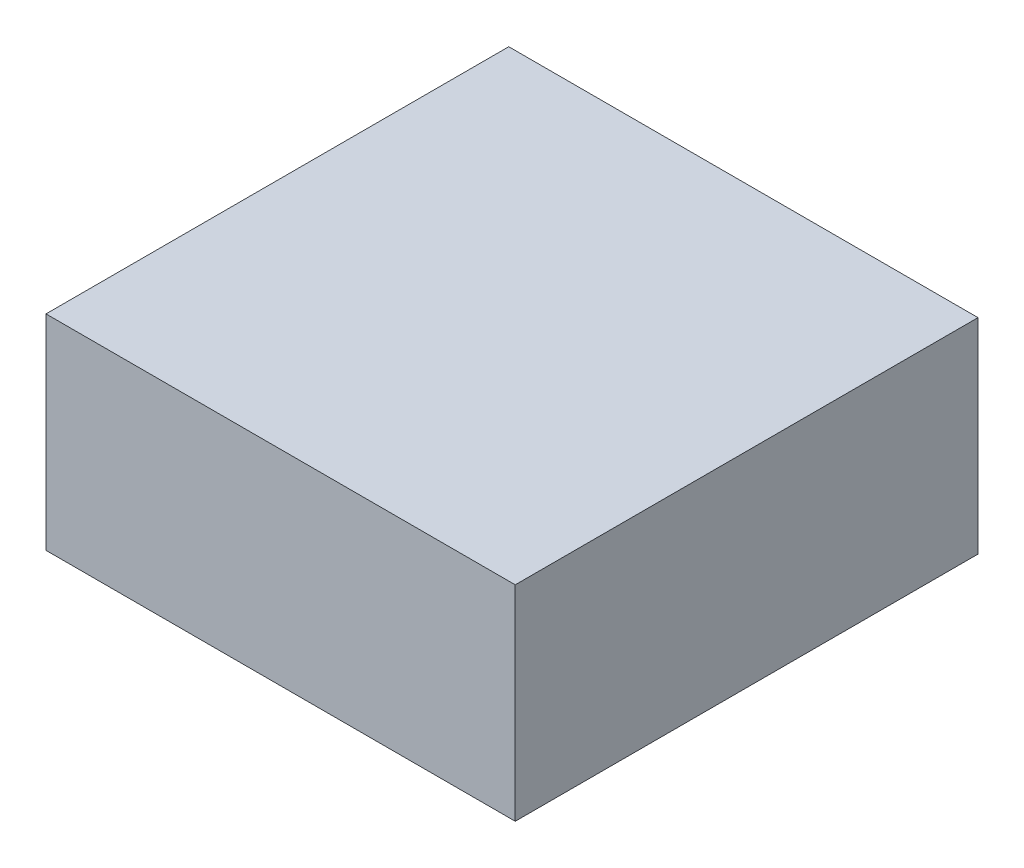
ISO-10303-21;
HEADER;
FILE_DESCRIPTION(('STEP AP214'),'2;1');
FILE_NAME('part.step','',(''),(''),'','','');
FILE_SCHEMA(('AUTOMOTIVE_DESIGN { 1 0 10303 214 1 1 1 1 }'));
ENDSEC;
DATA;
#1=APPLICATION_CONTEXT('core data for automotive mechanical design processes');
#2=APPLICATION_PROTOCOL_DEFINITION('international standard','automotive_design',2000,#1);
#3=PRODUCT_CONTEXT('',#1,'mechanical');
#4=PRODUCT('Part','Part','',(#3));
#5=PRODUCT_RELATED_PRODUCT_CATEGORY('part','',(#4));
#6=PRODUCT_DEFINITION_FORMATION('','',#4);
#7=PRODUCT_DEFINITION_CONTEXT('part definition',#1,'design');
#8=PRODUCT_DEFINITION('design','',#6,#7);
#9=PRODUCT_DEFINITION_SHAPE('','',#8);
#10=(LENGTH_UNIT() NAMED_UNIT(*) SI_UNIT(.MILLI.,.METRE.));
#11=(NAMED_UNIT(*) PLANE_ANGLE_UNIT() SI_UNIT($,.RADIAN.));
#12=(NAMED_UNIT(*) SI_UNIT($,.STERADIAN.) SOLID_ANGLE_UNIT());
#13=UNCERTAINTY_MEASURE_WITH_UNIT(LENGTH_MEASURE(1.E-05),#10,'distance_accuracy_value','');
#14=(GEOMETRIC_REPRESENTATION_CONTEXT(3) GLOBAL_UNCERTAINTY_ASSIGNED_CONTEXT((#13)) GLOBAL_UNIT_ASSIGNED_CONTEXT((#10,
#11,#12)) REPRESENTATION_CONTEXT('',''));
#15=CARTESIAN_POINT('',(0.,0.,0.));
#16=DIRECTION('',(0.,0.,1.));
#17=DIRECTION('',(1.,0.,0.));
#18=AXIS2_PLACEMENT_3D('',#15,#16,#17);
#19=CARTESIAN_POINT('',(181.,158.,178.5));
#20=DIRECTION('',(-1.,0.,0.));
#21=DIRECTION('',(0.,0.,1.));
#22=AXIS2_PLACEMENT_3D('',#19,#20,#21);
#23=PLANE('',#22);
#24=DIRECTION('',(0.,0.,-1.));
#25=VECTOR('',#24,1.);
#26=CARTESIAN_POINT('',(181.,0.,178.5));
#27=LINE('',#26,#25);
#28=CARTESIAN_POINT('',(181.,0.,178.5));
#29=VERTEX_POINT('',#28);
#30=CARTESIAN_POINT('',(181.,0.,-178.5));
#31=VERTEX_POINT('',#30);
#32=EDGE_CURVE('E101',#29,#31,#27,.T.);
#33=ORIENTED_EDGE('',*,*,#32,.T.);
#34=DIRECTION('',(0.,-1.,0.));
#35=VECTOR('',#34,1.);
#36=CARTESIAN_POINT('',(181.,158.,-178.5));
#37=LINE('',#36,#35);
#38=CARTESIAN_POINT('',(181.,158.,-178.5));
#39=VERTEX_POINT('',#38);
#40=EDGE_CURVE('E11',#39,#31,#37,.T.);
#41=ORIENTED_EDGE('',*,*,#40,.F.);
#42=DIRECTION('',(0.,0.,-1.));
#43=VECTOR('',#42,1.);
#44=CARTESIAN_POINT('',(181.,158.,178.5));
#45=LINE('',#44,#43);
#46=CARTESIAN_POINT('',(181.,158.,178.5));
#47=VERTEX_POINT('',#46);
#48=EDGE_CURVE('E89',#47,#39,#45,.T.);
#49=ORIENTED_EDGE('',*,*,#48,.F.);
#50=DIRECTION('',(0.,-1.,0.));
#51=VECTOR('',#50,1.);
#52=CARTESIAN_POINT('',(181.,158.,178.5));
#53=LINE('',#52,#51);
#54=EDGE_CURVE('E97',#47,#29,#53,.T.);
#55=ORIENTED_EDGE('',*,*,#54,.T.);
#56=EDGE_LOOP('',(#33,#41,#49,#55));
#57=FACE_BOUND('',#56,.T.);
#58=ADVANCED_FACE('F38',(#57),#23,.F.);
#59=CARTESIAN_POINT('',(-181.,158.,-178.5));
#60=DIRECTION('',(0.,0.,1.));
#61=DIRECTION('',(1.,0.,0.));
#62=AXIS2_PLACEMENT_3D('',#59,#60,#61);
#63=PLANE('',#62);
#64=DIRECTION('',(-1.,0.,0.));
#65=VECTOR('',#64,1.);
#66=CARTESIAN_POINT('',(-181.,0.,-178.5));
#67=LINE('',#66,#65);
#68=CARTESIAN_POINT('',(-181.,0.,-178.5));
#69=VERTEX_POINT('',#68);
#70=EDGE_CURVE('E93',#31,#69,#67,.T.);
#71=ORIENTED_EDGE('',*,*,#70,.T.);
#72=DIRECTION('',(0.,-1.,0.));
#73=VECTOR('',#72,1.);
#74=CARTESIAN_POINT('',(-181.,158.,-178.5));
#75=LINE('',#74,#73);
#76=CARTESIAN_POINT('',(-181.,158.,-178.5));
#77=VERTEX_POINT('',#76);
#78=EDGE_CURVE('E46',#77,#69,#75,.T.);
#79=ORIENTED_EDGE('',*,*,#78,.F.);
#80=DIRECTION('',(-1.,0.,0.));
#81=VECTOR('',#80,1.);
#82=CARTESIAN_POINT('',(-181.,158.,-178.5));
#83=LINE('',#82,#81);
#84=EDGE_CURVE('E84',#39,#77,#83,.T.);
#85=ORIENTED_EDGE('',*,*,#84,.F.);
#86=ORIENTED_EDGE('',*,*,#40,.T.);
#87=EDGE_LOOP('',(#71,#79,#85,#86));
#88=FACE_BOUND('',#87,.T.);
#89=ADVANCED_FACE('F92',(#88),#63,.F.);
#90=CARTESIAN_POINT('',(-181.,158.,178.5));
#91=DIRECTION('',(1.,0.,0.));
#92=DIRECTION('',(0.,0.,-1.));
#93=AXIS2_PLACEMENT_3D('',#90,#91,#92);
#94=PLANE('',#93);
#95=DIRECTION('',(0.,0.,1.));
#96=VECTOR('',#95,1.);
#97=CARTESIAN_POINT('',(-181.,0.,178.5));
#98=LINE('',#97,#96);
#99=CARTESIAN_POINT('',(-181.,0.,178.5));
#100=VERTEX_POINT('',#99);
#101=EDGE_CURVE('E71',#69,#100,#98,.T.);
#102=ORIENTED_EDGE('',*,*,#101,.T.);
#103=DIRECTION('',(0.,-1.,0.));
#104=VECTOR('',#103,1.);
#105=CARTESIAN_POINT('',(-181.,158.,178.5));
#106=LINE('',#105,#104);
#107=CARTESIAN_POINT('',(-181.,158.,178.5));
#108=VERTEX_POINT('',#107);
#109=EDGE_CURVE('E94',#108,#100,#106,.T.);
#110=ORIENTED_EDGE('',*,*,#109,.F.);
#111=DIRECTION('',(0.,0.,1.));
#112=VECTOR('',#111,1.);
#113=CARTESIAN_POINT('',(-181.,158.,178.5));
#114=LINE('',#113,#112);
#115=EDGE_CURVE('E87',#77,#108,#114,.T.);
#116=ORIENTED_EDGE('',*,*,#115,.F.);
#117=ORIENTED_EDGE('',*,*,#78,.T.);
#118=EDGE_LOOP('',(#102,#110,#116,#117));
#119=FACE_BOUND('',#118,.T.);
#120=ADVANCED_FACE('F95',(#119),#94,.F.);
#121=CARTESIAN_POINT('',(-181.,158.,178.5));
#122=DIRECTION('',(0.,0.,-1.));
#123=DIRECTION('',(-1.,0.,0.));
#124=AXIS2_PLACEMENT_3D('',#121,#122,#123);
#125=PLANE('',#124);
#126=DIRECTION('',(1.,0.,0.));
#127=VECTOR('',#126,1.);
#128=CARTESIAN_POINT('',(-181.,0.,178.5));
#129=LINE('',#128,#127);
#130=EDGE_CURVE('E77',#100,#29,#129,.T.);
#131=ORIENTED_EDGE('',*,*,#130,.T.);
#132=ORIENTED_EDGE('',*,*,#54,.F.);
#133=DIRECTION('',(1.,0.,0.));
#134=VECTOR('',#133,1.);
#135=CARTESIAN_POINT('',(-181.,158.,178.5));
#136=LINE('',#135,#134);
#137=EDGE_CURVE('E54',#108,#47,#136,.T.);
#138=ORIENTED_EDGE('',*,*,#137,.F.);
#139=ORIENTED_EDGE('',*,*,#109,.T.);
#140=EDGE_LOOP('',(#131,#132,#138,#139));
#141=FACE_BOUND('',#140,.T.);
#142=ADVANCED_FACE('F108',(#141),#125,.F.);
#143=CARTESIAN_POINT('',(0.,158.,0.));
#144=DIRECTION('',(0.,-1.,0.));
#145=DIRECTION('',(0.,0.,-1.));
#146=AXIS2_PLACEMENT_3D('',#143,#144,#145);
#147=PLANE('',#146);
#148=ORIENTED_EDGE('',*,*,#48,.T.);
#149=ORIENTED_EDGE('',*,*,#84,.T.);
#150=ORIENTED_EDGE('',*,*,#115,.T.);
#151=ORIENTED_EDGE('',*,*,#137,.T.);
#152=EDGE_LOOP('',(#148,#149,#150,#151));
#153=FACE_BOUND('',#152,.T.);
#154=ADVANCED_FACE('F85',(#153),#147,.F.);
#155=CARTESIAN_POINT('',(0.,0.,0.));
#156=DIRECTION('',(0.,-1.,0.));
#157=DIRECTION('',(0.,0.,-1.));
#158=AXIS2_PLACEMENT_3D('',#155,#156,#157);
#159=PLANE('',#158);
#160=ORIENTED_EDGE('',*,*,#32,.F.);
#161=ORIENTED_EDGE('',*,*,#130,.F.);
#162=ORIENTED_EDGE('',*,*,#101,.F.);
#163=ORIENTED_EDGE('',*,*,#70,.F.);
#164=EDGE_LOOP('',(#160,#161,#162,#163));
#165=FACE_BOUND('',#164,.T.);
#166=ADVANCED_FACE('F111',(#165),#159,.T.);
#167=CLOSED_SHELL('',(#58,#89,#120,#142,#154,#166));
#168=MANIFOLD_SOLID_BREP('B2',#167);
#169=ADVANCED_BREP_SHAPE_REPRESENTATION('',(#18,#168),#14);
#170=SHAPE_DEFINITION_REPRESENTATION(#9,#169);
ENDSEC;
END-ISO-10303-21;
